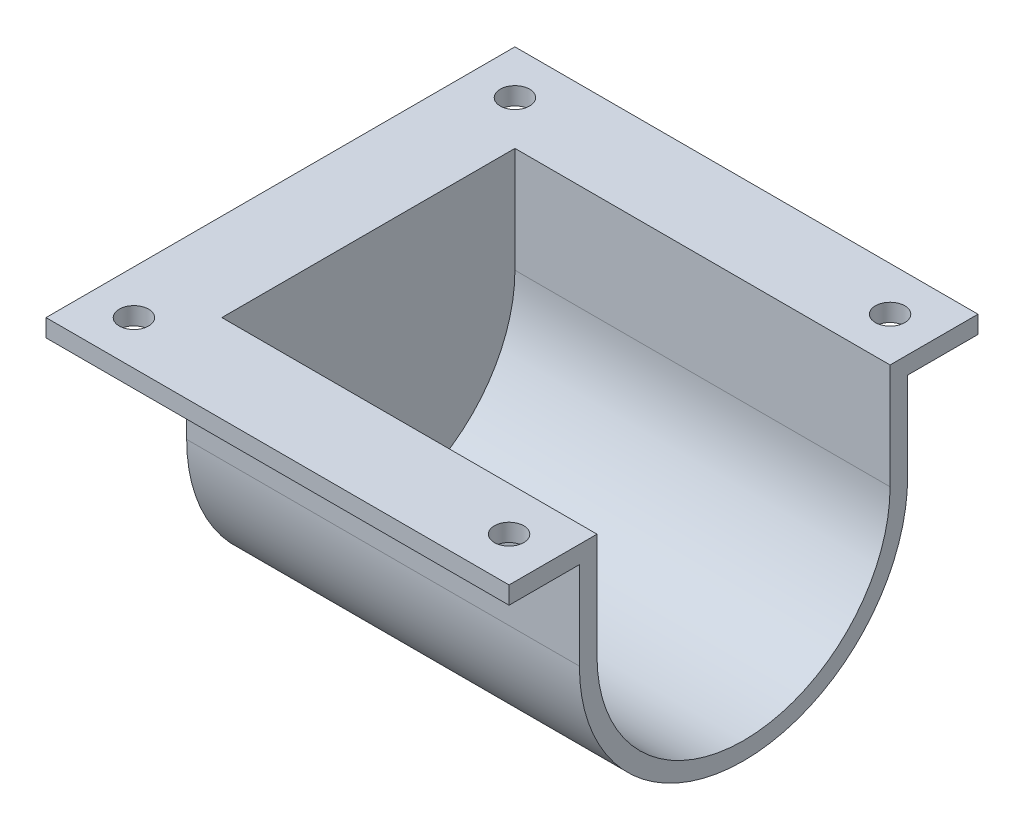
ISO-10303-21;
HEADER;
FILE_DESCRIPTION(('STEP AP214'),'2;1');
FILE_NAME('part.step','',(''),(''),'','','');
FILE_SCHEMA(('AUTOMOTIVE_DESIGN { 1 0 10303 214 1 1 1 1 }'));
ENDSEC;
DATA;
#1=APPLICATION_CONTEXT('core data for automotive mechanical design processes');
#2=APPLICATION_PROTOCOL_DEFINITION('international standard','automotive_design',2000,#1);
#3=PRODUCT_CONTEXT('',#1,'mechanical');
#4=PRODUCT('Part','Part','',(#3));
#5=PRODUCT_RELATED_PRODUCT_CATEGORY('part','',(#4));
#6=PRODUCT_DEFINITION_FORMATION('','',#4);
#7=PRODUCT_DEFINITION_CONTEXT('part definition',#1,'design');
#8=PRODUCT_DEFINITION('design','',#6,#7);
#9=PRODUCT_DEFINITION_SHAPE('','',#8);
#10=(LENGTH_UNIT() NAMED_UNIT(*) SI_UNIT(.MILLI.,.METRE.));
#11=(NAMED_UNIT(*) PLANE_ANGLE_UNIT() SI_UNIT($,.RADIAN.));
#12=(NAMED_UNIT(*) SI_UNIT($,.STERADIAN.) SOLID_ANGLE_UNIT());
#13=UNCERTAINTY_MEASURE_WITH_UNIT(LENGTH_MEASURE(1.E-05),#10,'distance_accuracy_value','');
#14=(GEOMETRIC_REPRESENTATION_CONTEXT(3) GLOBAL_UNCERTAINTY_ASSIGNED_CONTEXT((#13)) GLOBAL_UNIT_ASSIGNED_CONTEXT((#10,
#11,#12)) REPRESENTATION_CONTEXT('',''));
#15=CARTESIAN_POINT('',(0.,0.,0.));
#16=DIRECTION('',(0.,0.,1.));
#17=DIRECTION('',(1.,0.,0.));
#18=AXIS2_PLACEMENT_3D('',#15,#16,#17);
#19=CARTESIAN_POINT('',(-67.,0.,28.));
#20=DIRECTION('',(0.,0.,1.));
#21=DIRECTION('',(1.,0.,0.));
#22=AXIS2_PLACEMENT_3D('',#19,#20,#21);
#23=PLANE('',#22);
#24=DIRECTION('',(0.,-1.,0.));
#25=VECTOR('',#24,1.);
#26=CARTESIAN_POINT('',(0.,0.,28.));
#27=LINE('',#26,#25);
#28=CARTESIAN_POINT('',(0.,15.,28.));
#29=VERTEX_POINT('',#28);
#30=CARTESIAN_POINT('',(0.,0.,28.));
#31=VERTEX_POINT('',#30);
#32=EDGE_CURVE('E220',#29,#31,#27,.T.);
#33=ORIENTED_EDGE('',*,*,#32,.F.);
#34=DIRECTION('',(1.,0.,0.));
#35=VECTOR('',#34,1.);
#36=CARTESIAN_POINT('',(-67.,15.,28.));
#37=LINE('',#36,#35);
#38=CARTESIAN_POINT('',(-67.,15.,28.));
#39=VERTEX_POINT('',#38);
#40=EDGE_CURVE('E12',#39,#29,#37,.T.);
#41=ORIENTED_EDGE('',*,*,#40,.F.);
#42=DIRECTION('',(0.,-1.,0.));
#43=VECTOR('',#42,1.);
#44=CARTESIAN_POINT('',(-67.,0.,28.));
#45=LINE('',#44,#43);
#46=CARTESIAN_POINT('',(-67.,0.,28.));
#47=VERTEX_POINT('',#46);
#48=EDGE_CURVE('E225',#39,#47,#45,.T.);
#49=ORIENTED_EDGE('',*,*,#48,.T.);
#50=DIRECTION('',(1.,0.,0.));
#51=VECTOR('',#50,1.);
#52=CARTESIAN_POINT('',(-67.,0.,28.));
#53=LINE('',#52,#51);
#54=EDGE_CURVE('E54',#47,#31,#53,.T.);
#55=ORIENTED_EDGE('',*,*,#54,.T.);
#56=EDGE_LOOP('',(#33,#41,#49,#55));
#57=FACE_BOUND('',#56,.T.);
#58=ADVANCED_FACE('F55',(#57),#23,.T.);
#59=CARTESIAN_POINT('',(-67.,0.,-28.));
#60=DIRECTION('',(0.,0.,1.));
#61=DIRECTION('',(1.,0.,0.));
#62=AXIS2_PLACEMENT_3D('',#59,#60,#61);
#63=PLANE('',#62);
#64=DIRECTION('',(0.,-1.,0.));
#65=VECTOR('',#64,1.);
#66=CARTESIAN_POINT('',(0.,0.,-28.));
#67=LINE('',#66,#65);
#68=CARTESIAN_POINT('',(0.,15.,-28.));
#69=VERTEX_POINT('',#68);
#70=CARTESIAN_POINT('',(0.,0.,-28.));
#71=VERTEX_POINT('',#70);
#72=EDGE_CURVE('E227',#69,#71,#67,.T.);
#73=ORIENTED_EDGE('',*,*,#72,.T.);
#74=DIRECTION('',(1.,0.,0.));
#75=VECTOR('',#74,1.);
#76=CARTESIAN_POINT('',(-67.,0.,-28.));
#77=LINE('',#76,#75);
#78=CARTESIAN_POINT('',(-67.,0.,-28.));
#79=VERTEX_POINT('',#78);
#80=EDGE_CURVE('E237',#79,#71,#77,.T.);
#81=ORIENTED_EDGE('',*,*,#80,.F.);
#82=DIRECTION('',(0.,-1.,0.));
#83=VECTOR('',#82,1.);
#84=CARTESIAN_POINT('',(-67.,0.,-28.));
#85=LINE('',#84,#83);
#86=CARTESIAN_POINT('',(-67.,15.,-28.));
#87=VERTEX_POINT('',#86);
#88=EDGE_CURVE('E230',#87,#79,#85,.T.);
#89=ORIENTED_EDGE('',*,*,#88,.F.);
#90=DIRECTION('',(1.,0.,0.));
#91=VECTOR('',#90,1.);
#92=CARTESIAN_POINT('',(-67.,15.,-28.));
#93=LINE('',#92,#91);
#94=EDGE_CURVE('E58',#87,#69,#93,.T.);
#95=ORIENTED_EDGE('',*,*,#94,.T.);
#96=EDGE_LOOP('',(#73,#81,#89,#95));
#97=FACE_BOUND('',#96,.T.);
#98=ADVANCED_FACE('F254',(#97),#63,.F.);
#99=CARTESIAN_POINT('',(-67.,0.,0.));
#100=DIRECTION('',(1.,0.,0.));
#101=DIRECTION('',(0.,0.,-1.));
#102=AXIS2_PLACEMENT_3D('',#99,#100,#101);
#103=CYLINDRICAL_SURFACE('',#102,28.);
#104=CARTESIAN_POINT('',(0.,0.,0.));
#105=DIRECTION('',(1.,0.,0.));
#106=DIRECTION('',(0.,0.,-1.));
#107=AXIS2_PLACEMENT_3D('',#104,#105,#106);
#108=CIRCLE('',#107,28.);
#109=EDGE_CURVE('E232',#31,#71,#108,.T.);
#110=ORIENTED_EDGE('',*,*,#109,.F.);
#111=ORIENTED_EDGE('',*,*,#54,.F.);
#112=CARTESIAN_POINT('',(-67.,0.,0.));
#113=DIRECTION('',(1.,0.,0.));
#114=DIRECTION('',(0.,0.,-1.));
#115=AXIS2_PLACEMENT_3D('',#112,#113,#114);
#116=CIRCLE('',#115,28.);
#117=EDGE_CURVE('E228',#47,#79,#116,.T.);
#118=ORIENTED_EDGE('',*,*,#117,.T.);
#119=ORIENTED_EDGE('',*,*,#80,.T.);
#120=EDGE_LOOP('',(#110,#111,#118,#119));
#121=FACE_BOUND('',#120,.T.);
#122=ADVANCED_FACE('F241',(#121),#103,.T.);
#123=CARTESIAN_POINT('',(-67.,0.,0.));
#124=DIRECTION('',(1.,0.,0.));
#125=DIRECTION('',(0.,0.,-1.));
#126=AXIS2_PLACEMENT_3D('',#123,#124,#125);
#127=PLANE('',#126);
#128=ORIENTED_EDGE('',*,*,#48,.F.);
#129=DIRECTION('',(0.,0.,-1.));
#130=VECTOR('',#129,1.);
#131=CARTESIAN_POINT('',(-67.,15.,0.));
#132=LINE('',#131,#130);
#133=EDGE_CURVE('E233',#39,#87,#132,.T.);
#134=ORIENTED_EDGE('',*,*,#133,.T.);
#135=ORIENTED_EDGE('',*,*,#88,.T.);
#136=ORIENTED_EDGE('',*,*,#117,.F.);
#137=EDGE_LOOP('',(#128,#134,#135,#136));
#138=FACE_BOUND('',#137,.T.);
#139=ADVANCED_FACE('F255',(#138),#127,.F.);
#140=CARTESIAN_POINT('',(0.,0.,0.));
#141=DIRECTION('',(1.,0.,0.));
#142=DIRECTION('',(0.,0.,-1.));
#143=AXIS2_PLACEMENT_3D('',#140,#141,#142);
#144=PLANE('',#143);
#145=DIRECTION('',(0.,-1.,0.));
#146=VECTOR('',#145,1.);
#147=CARTESIAN_POINT('',(0.,0.,25.));
#148=LINE('',#147,#146);
#149=CARTESIAN_POINT('',(0.,18.,25.));
#150=VERTEX_POINT('',#149);
#151=CARTESIAN_POINT('',(0.,0.,25.));
#152=VERTEX_POINT('',#151);
#153=EDGE_CURVE('E187',#150,#152,#148,.T.);
#154=ORIENTED_EDGE('',*,*,#153,.F.);
#155=DIRECTION('',(0.,0.,1.));
#156=VECTOR('',#155,1.);
#157=CARTESIAN_POINT('',(0.,18.,0.));
#158=LINE('',#157,#156);
#159=CARTESIAN_POINT('',(0.,18.,40.));
#160=VERTEX_POINT('',#159);
#161=EDGE_CURVE('E167',#150,#160,#158,.T.);
#162=ORIENTED_EDGE('',*,*,#161,.T.);
#163=DIRECTION('',(0.,1.,0.));
#164=VECTOR('',#163,1.);
#165=CARTESIAN_POINT('',(0.,0.,40.));
#166=LINE('',#165,#164);
#167=CARTESIAN_POINT('',(0.,15.,40.));
#168=VERTEX_POINT('',#167);
#169=EDGE_CURVE('E209',#168,#160,#166,.T.);
#170=ORIENTED_EDGE('',*,*,#169,.F.);
#171=DIRECTION('',(0.,0.,-1.));
#172=VECTOR('',#171,1.);
#173=CARTESIAN_POINT('',(0.,15.,0.));
#174=LINE('',#173,#172);
#175=EDGE_CURVE('E196',#168,#29,#174,.T.);
#176=ORIENTED_EDGE('',*,*,#175,.T.);
#177=ORIENTED_EDGE('',*,*,#32,.T.);
#178=ORIENTED_EDGE('',*,*,#109,.T.);
#179=ORIENTED_EDGE('',*,*,#72,.F.);
#180=CARTESIAN_POINT('',(0.,15.,-40.));
#181=VERTEX_POINT('',#180);
#182=EDGE_CURVE('E211',#69,#181,#174,.T.);
#183=ORIENTED_EDGE('',*,*,#182,.T.);
#184=DIRECTION('',(0.,1.,0.));
#185=VECTOR('',#184,1.);
#186=CARTESIAN_POINT('',(0.,0.,-40.));
#187=LINE('',#186,#185);
#188=CARTESIAN_POINT('',(0.,18.,-40.));
#189=VERTEX_POINT('',#188);
#190=EDGE_CURVE('E171',#181,#189,#187,.T.);
#191=ORIENTED_EDGE('',*,*,#190,.T.);
#192=CARTESIAN_POINT('',(0.,18.,-25.));
#193=VERTEX_POINT('',#192);
#194=EDGE_CURVE('E207',#189,#193,#158,.T.);
#195=ORIENTED_EDGE('',*,*,#194,.T.);
#196=DIRECTION('',(0.,-1.,0.));
#197=VECTOR('',#196,1.);
#198=CARTESIAN_POINT('',(0.,0.,-25.));
#199=LINE('',#198,#197);
#200=CARTESIAN_POINT('',(0.,0.,-25.));
#201=VERTEX_POINT('',#200);
#202=EDGE_CURVE('E164',#193,#201,#199,.T.);
#203=ORIENTED_EDGE('',*,*,#202,.T.);
#204=CARTESIAN_POINT('',(0.,0.,0.));
#205=DIRECTION('',(1.,0.,0.));
#206=DIRECTION('',(0.,0.,-1.));
#207=AXIS2_PLACEMENT_3D('',#204,#205,#206);
#208=CIRCLE('',#207,25.);
#209=EDGE_CURVE('E189',#152,#201,#208,.T.);
#210=ORIENTED_EDGE('',*,*,#209,.F.);
#211=EDGE_LOOP('',(#154,#162,#170,#176,#177,#178,#179,#183,#191,#195,#203,#210));
#212=FACE_BOUND('',#211,.T.);
#213=ADVANCED_FACE('F243',(#212),#144,.T.);
#214=CARTESIAN_POINT('',(-79.,15.,0.));
#215=DIRECTION('',(0.,-1.,0.));
#216=DIRECTION('',(0.,0.,-1.));
#217=AXIS2_PLACEMENT_3D('',#214,#215,#216);
#218=PLANE('',#217);
#219=CARTESIAN_POINT('',(-71.5,15.,32.5));
#220=DIRECTION('',(0.,-1.,0.));
#221=DIRECTION('',(0.,0.,-1.));
#222=AXIS2_PLACEMENT_3D('',#219,#220,#221);
#223=CIRCLE('',#222,2.49999999999999);
#224=CARTESIAN_POINT('',(-71.5,15.,30.));
#225=VERTEX_POINT('',#224);
#226=EDGE_CURVE('E310',#225,#225,#223,.T.);
#227=ORIENTED_EDGE('',*,*,#226,.F.);
#228=EDGE_LOOP('',(#227));
#229=FACE_BOUND('',#228,.T.);
#230=CARTESIAN_POINT('',(-7.5,15.,32.5));
#231=DIRECTION('',(0.,-1.,0.));
#232=DIRECTION('',(0.,0.,-1.));
#233=AXIS2_PLACEMENT_3D('',#230,#231,#232);
#234=CIRCLE('',#233,2.49999999999999);
#235=CARTESIAN_POINT('',(-7.5,15.,30.));
#236=VERTEX_POINT('',#235);
#237=EDGE_CURVE('E311',#236,#236,#234,.T.);
#238=ORIENTED_EDGE('',*,*,#237,.F.);
#239=EDGE_LOOP('',(#238));
#240=FACE_BOUND('',#239,.T.);
#241=CARTESIAN_POINT('',(-71.5,15.,-32.5));
#242=DIRECTION('',(0.,-1.,0.));
#243=DIRECTION('',(0.,0.,-1.));
#244=AXIS2_PLACEMENT_3D('',#241,#242,#243);
#245=CIRCLE('',#244,2.49999999999999);
#246=CARTESIAN_POINT('',(-71.5,15.,-35.));
#247=VERTEX_POINT('',#246);
#248=EDGE_CURVE('E314',#247,#247,#245,.T.);
#249=ORIENTED_EDGE('',*,*,#248,.F.);
#250=EDGE_LOOP('',(#249));
#251=FACE_BOUND('',#250,.T.);
#252=CARTESIAN_POINT('',(-7.5,15.,-32.5));
#253=DIRECTION('',(0.,-1.,0.));
#254=DIRECTION('',(0.,0.,-1.));
#255=AXIS2_PLACEMENT_3D('',#252,#253,#254);
#256=CIRCLE('',#255,2.49999999999999);
#257=CARTESIAN_POINT('',(-7.5,15.,-35.));
#258=VERTEX_POINT('',#257);
#259=EDGE_CURVE('E177',#258,#258,#256,.T.);
#260=ORIENTED_EDGE('',*,*,#259,.F.);
#261=EDGE_LOOP('',(#260));
#262=FACE_BOUND('',#261,.T.);
#263=ORIENTED_EDGE('',*,*,#94,.F.);
#264=ORIENTED_EDGE('',*,*,#133,.F.);
#265=ORIENTED_EDGE('',*,*,#40,.T.);
#266=ORIENTED_EDGE('',*,*,#175,.F.);
#267=DIRECTION('',(1.,0.,0.));
#268=VECTOR('',#267,1.);
#269=CARTESIAN_POINT('',(-79.,15.,40.));
#270=LINE('',#269,#268);
#271=CARTESIAN_POINT('',(-79.,15.,40.));
#272=VERTEX_POINT('',#271);
#273=EDGE_CURVE('E218',#272,#168,#270,.T.);
#274=ORIENTED_EDGE('',*,*,#273,.F.);
#275=DIRECTION('',(0.,0.,-1.));
#276=VECTOR('',#275,1.);
#277=CARTESIAN_POINT('',(-79.,15.,0.));
#278=LINE('',#277,#276);
#279=CARTESIAN_POINT('',(-79.,15.,-40.));
#280=VERTEX_POINT('',#279);
#281=EDGE_CURVE('E204',#272,#280,#278,.T.);
#282=ORIENTED_EDGE('',*,*,#281,.T.);
#283=DIRECTION('',(1.,0.,0.));
#284=VECTOR('',#283,1.);
#285=CARTESIAN_POINT('',(-79.,15.,-40.));
#286=LINE('',#285,#284);
#287=EDGE_CURVE('E212',#280,#181,#286,.T.);
#288=ORIENTED_EDGE('',*,*,#287,.T.);
#289=ORIENTED_EDGE('',*,*,#182,.F.);
#290=EDGE_LOOP('',(#263,#264,#265,#266,#274,#282,#288,#289));
#291=FACE_BOUND('',#290,.T.);
#292=ADVANCED_FACE('F250',(#229,#240,#251,#262,#291),#218,.T.);
#293=CARTESIAN_POINT('',(-79.,0.,-40.));
#294=DIRECTION('',(0.,0.,-1.));
#295=DIRECTION('',(-1.,0.,0.));
#296=AXIS2_PLACEMENT_3D('',#293,#294,#295);
#297=PLANE('',#296);
#298=ORIENTED_EDGE('',*,*,#190,.F.);
#299=ORIENTED_EDGE('',*,*,#287,.F.);
#300=DIRECTION('',(0.,1.,0.));
#301=VECTOR('',#300,1.);
#302=CARTESIAN_POINT('',(-79.,0.,-40.));
#303=LINE('',#302,#301);
#304=CARTESIAN_POINT('',(-79.,18.,-40.));
#305=VERTEX_POINT('',#304);
#306=EDGE_CURVE('E195',#280,#305,#303,.T.);
#307=ORIENTED_EDGE('',*,*,#306,.T.);
#308=DIRECTION('',(1.,0.,0.));
#309=VECTOR('',#308,1.);
#310=CARTESIAN_POINT('',(-79.,18.,-40.));
#311=LINE('',#310,#309);
#312=EDGE_CURVE('E205',#305,#189,#311,.T.);
#313=ORIENTED_EDGE('',*,*,#312,.T.);
#314=EDGE_LOOP('',(#298,#299,#307,#313));
#315=FACE_BOUND('',#314,.T.);
#316=ADVANCED_FACE('F260',(#315),#297,.T.);
#317=CARTESIAN_POINT('',(-79.,0.,40.));
#318=DIRECTION('',(0.,0.,-1.));
#319=DIRECTION('',(0.,1.,0.));
#320=AXIS2_PLACEMENT_3D('',#317,#318,#319);
#321=PLANE('',#320);
#322=ORIENTED_EDGE('',*,*,#169,.T.);
#323=DIRECTION('',(1.,0.,0.));
#324=VECTOR('',#323,1.);
#325=CARTESIAN_POINT('',(-79.,18.,40.));
#326=LINE('',#325,#324);
#327=CARTESIAN_POINT('',(-79.,18.,40.));
#328=VERTEX_POINT('',#327);
#329=EDGE_CURVE('E223',#328,#160,#326,.T.);
#330=ORIENTED_EDGE('',*,*,#329,.F.);
#331=DIRECTION('',(0.,1.,0.));
#332=VECTOR('',#331,1.);
#333=CARTESIAN_POINT('',(-79.,0.,40.));
#334=LINE('',#333,#332);
#335=EDGE_CURVE('E197',#272,#328,#334,.T.);
#336=ORIENTED_EDGE('',*,*,#335,.F.);
#337=ORIENTED_EDGE('',*,*,#273,.T.);
#338=EDGE_LOOP('',(#322,#330,#336,#337));
#339=FACE_BOUND('',#338,.T.);
#340=ADVANCED_FACE('F270',(#339),#321,.F.);
#341=CARTESIAN_POINT('',(-79.,18.,0.));
#342=DIRECTION('',(0.,1.,0.));
#343=DIRECTION('',(0.,0.,1.));
#344=AXIS2_PLACEMENT_3D('',#341,#342,#343);
#345=PLANE('',#344);
#346=CARTESIAN_POINT('',(-71.5,18.,32.5));
#347=DIRECTION('',(0.,-1.,0.));
#348=DIRECTION('',(0.,0.,-1.));
#349=AXIS2_PLACEMENT_3D('',#346,#347,#348);
#350=CIRCLE('',#349,2.49999999999999);
#351=CARTESIAN_POINT('',(-71.5,18.,30.));
#352=VERTEX_POINT('',#351);
#353=EDGE_CURVE('E332',#352,#352,#350,.T.);
#354=ORIENTED_EDGE('',*,*,#353,.T.);
#355=EDGE_LOOP('',(#354));
#356=FACE_BOUND('',#355,.T.);
#357=CARTESIAN_POINT('',(-7.5,18.,32.5));
#358=DIRECTION('',(0.,-1.,0.));
#359=DIRECTION('',(0.,0.,-1.));
#360=AXIS2_PLACEMENT_3D('',#357,#358,#359);
#361=CIRCLE('',#360,2.49999999999999);
#362=CARTESIAN_POINT('',(-7.5,18.,30.));
#363=VERTEX_POINT('',#362);
#364=EDGE_CURVE('E328',#363,#363,#361,.T.);
#365=ORIENTED_EDGE('',*,*,#364,.T.);
#366=EDGE_LOOP('',(#365));
#367=FACE_BOUND('',#366,.T.);
#368=CARTESIAN_POINT('',(-71.5,18.,-32.5));
#369=DIRECTION('',(0.,-1.,0.));
#370=DIRECTION('',(0.,0.,-1.));
#371=AXIS2_PLACEMENT_3D('',#368,#369,#370);
#372=CIRCLE('',#371,2.49999999999999);
#373=CARTESIAN_POINT('',(-71.5,18.,-35.));
#374=VERTEX_POINT('',#373);
#375=EDGE_CURVE('E325',#374,#374,#372,.T.);
#376=ORIENTED_EDGE('',*,*,#375,.T.);
#377=EDGE_LOOP('',(#376));
#378=FACE_BOUND('',#377,.T.);
#379=CARTESIAN_POINT('',(-7.5,18.,-32.5));
#380=DIRECTION('',(0.,-1.,0.));
#381=DIRECTION('',(0.,0.,-1.));
#382=AXIS2_PLACEMENT_3D('',#379,#380,#381);
#383=CIRCLE('',#382,2.49999999999999);
#384=CARTESIAN_POINT('',(-7.5,18.,-35.));
#385=VERTEX_POINT('',#384);
#386=EDGE_CURVE('E316',#385,#385,#383,.T.);
#387=ORIENTED_EDGE('',*,*,#386,.T.);
#388=EDGE_LOOP('',(#387));
#389=FACE_BOUND('',#388,.T.);
#390=DIRECTION('',(1.,0.,0.));
#391=VECTOR('',#390,1.);
#392=CARTESIAN_POINT('',(-67.,18.,25.));
#393=LINE('',#392,#391);
#394=CARTESIAN_POINT('',(-64.,18.,25.));
#395=VERTEX_POINT('',#394);
#396=EDGE_CURVE('E163',#395,#150,#393,.T.);
#397=ORIENTED_EDGE('',*,*,#396,.F.);
#398=DIRECTION('',(0.,0.,-1.));
#399=VECTOR('',#398,1.);
#400=CARTESIAN_POINT('',(-64.,18.,0.));
#401=LINE('',#400,#399);
#402=CARTESIAN_POINT('',(-64.,18.,-25.));
#403=VERTEX_POINT('',#402);
#404=EDGE_CURVE('E148',#395,#403,#401,.T.);
#405=ORIENTED_EDGE('',*,*,#404,.T.);
#406=DIRECTION('',(1.,0.,0.));
#407=VECTOR('',#406,1.);
#408=CARTESIAN_POINT('',(-67.,18.,-25.));
#409=LINE('',#408,#407);
#410=EDGE_CURVE('E175',#403,#193,#409,.T.);
#411=ORIENTED_EDGE('',*,*,#410,.T.);
#412=ORIENTED_EDGE('',*,*,#194,.F.);
#413=ORIENTED_EDGE('',*,*,#312,.F.);
#414=DIRECTION('',(0.,0.,1.));
#415=VECTOR('',#414,1.);
#416=CARTESIAN_POINT('',(-79.,18.,0.));
#417=LINE('',#416,#415);
#418=EDGE_CURVE('E199',#305,#328,#417,.T.);
#419=ORIENTED_EDGE('',*,*,#418,.T.);
#420=ORIENTED_EDGE('',*,*,#329,.T.);
#421=ORIENTED_EDGE('',*,*,#161,.F.);
#422=EDGE_LOOP('',(#397,#405,#411,#412,#413,#419,#420,#421));
#423=FACE_BOUND('',#422,.T.);
#424=ADVANCED_FACE('F166',(#356,#367,#378,#389,#423),#345,.T.);
#425=CARTESIAN_POINT('',(-79.,0.,0.));
#426=DIRECTION('',(1.,0.,0.));
#427=DIRECTION('',(0.,0.,-1.));
#428=AXIS2_PLACEMENT_3D('',#425,#426,#427);
#429=PLANE('',#428);
#430=ORIENTED_EDGE('',*,*,#306,.F.);
#431=ORIENTED_EDGE('',*,*,#281,.F.);
#432=ORIENTED_EDGE('',*,*,#335,.T.);
#433=ORIENTED_EDGE('',*,*,#418,.F.);
#434=EDGE_LOOP('',(#430,#431,#432,#433));
#435=FACE_BOUND('',#434,.T.);
#436=ADVANCED_FACE('F272',(#435),#429,.F.);
#437=CARTESIAN_POINT('',(-67.,0.,25.));
#438=DIRECTION('',(0.,0.,1.));
#439=DIRECTION('',(1.,0.,0.));
#440=AXIS2_PLACEMENT_3D('',#437,#438,#439);
#441=PLANE('',#440);
#442=ORIENTED_EDGE('',*,*,#153,.T.);
#443=DIRECTION('',(1.,0.,0.));
#444=VECTOR('',#443,1.);
#445=CARTESIAN_POINT('',(-67.,0.,25.));
#446=LINE('',#445,#444);
#447=CARTESIAN_POINT('',(-64.,0.,25.));
#448=VERTEX_POINT('',#447);
#449=EDGE_CURVE('E158',#448,#152,#446,.T.);
#450=ORIENTED_EDGE('',*,*,#449,.F.);
#451=DIRECTION('',(0.,-1.,0.));
#452=VECTOR('',#451,1.);
#453=CARTESIAN_POINT('',(-64.,0.,25.));
#454=LINE('',#453,#452);
#455=EDGE_CURVE('E151',#395,#448,#454,.T.);
#456=ORIENTED_EDGE('',*,*,#455,.F.);
#457=ORIENTED_EDGE('',*,*,#396,.T.);
#458=EDGE_LOOP('',(#442,#450,#456,#457));
#459=FACE_BOUND('',#458,.T.);
#460=ADVANCED_FACE('F156',(#459),#441,.F.);
#461=CARTESIAN_POINT('',(-67.,0.,-25.));
#462=DIRECTION('',(0.,0.,1.));
#463=DIRECTION('',(1.,0.,0.));
#464=AXIS2_PLACEMENT_3D('',#461,#462,#463);
#465=PLANE('',#464);
#466=ORIENTED_EDGE('',*,*,#202,.F.);
#467=ORIENTED_EDGE('',*,*,#410,.F.);
#468=DIRECTION('',(0.,-1.,0.));
#469=VECTOR('',#468,1.);
#470=CARTESIAN_POINT('',(-64.,0.,-25.));
#471=LINE('',#470,#469);
#472=CARTESIAN_POINT('',(-64.,0.,-25.));
#473=VERTEX_POINT('',#472);
#474=EDGE_CURVE('E70',#403,#473,#471,.T.);
#475=ORIENTED_EDGE('',*,*,#474,.T.);
#476=DIRECTION('',(1.,0.,0.));
#477=VECTOR('',#476,1.);
#478=CARTESIAN_POINT('',(-67.,0.,-25.));
#479=LINE('',#478,#477);
#480=EDGE_CURVE('E176',#473,#201,#479,.T.);
#481=ORIENTED_EDGE('',*,*,#480,.T.);
#482=EDGE_LOOP('',(#466,#467,#475,#481));
#483=FACE_BOUND('',#482,.T.);
#484=ADVANCED_FACE('F265',(#483),#465,.T.);
#485=CARTESIAN_POINT('',(-67.,0.,0.));
#486=DIRECTION('',(1.,0.,0.));
#487=DIRECTION('',(0.,0.,-1.));
#488=AXIS2_PLACEMENT_3D('',#485,#486,#487);
#489=CYLINDRICAL_SURFACE('',#488,25.);
#490=ORIENTED_EDGE('',*,*,#209,.T.);
#491=ORIENTED_EDGE('',*,*,#480,.F.);
#492=CARTESIAN_POINT('',(-64.,0.,0.));
#493=DIRECTION('',(1.,0.,0.));
#494=DIRECTION('',(0.,0.,-1.));
#495=AXIS2_PLACEMENT_3D('',#492,#493,#494);
#496=CIRCLE('',#495,25.);
#497=EDGE_CURVE('E165',#448,#473,#496,.T.);
#498=ORIENTED_EDGE('',*,*,#497,.F.);
#499=ORIENTED_EDGE('',*,*,#449,.T.);
#500=EDGE_LOOP('',(#490,#491,#498,#499));
#501=FACE_BOUND('',#500,.T.);
#502=ADVANCED_FACE('F268',(#501),#489,.F.);
#503=CARTESIAN_POINT('',(-64.,0.,0.));
#504=DIRECTION('',(1.,0.,0.));
#505=DIRECTION('',(0.,0.,-1.));
#506=AXIS2_PLACEMENT_3D('',#503,#504,#505);
#507=PLANE('',#506);
#508=ORIENTED_EDGE('',*,*,#455,.T.);
#509=ORIENTED_EDGE('',*,*,#497,.T.);
#510=ORIENTED_EDGE('',*,*,#474,.F.);
#511=ORIENTED_EDGE('',*,*,#404,.F.);
#512=EDGE_LOOP('',(#508,#509,#510,#511));
#513=FACE_BOUND('',#512,.T.);
#514=ADVANCED_FACE('F154',(#513),#507,.T.);
#515=CARTESIAN_POINT('',(-7.5,0.,-32.5));
#516=DIRECTION('',(0.,-1.,0.));
#517=DIRECTION('',(0.,0.,-1.));
#518=AXIS2_PLACEMENT_3D('',#515,#516,#517);
#519=CYLINDRICAL_SURFACE('',#518,2.49999999999999);
#520=ORIENTED_EDGE('',*,*,#259,.T.);
#521=EDGE_LOOP('',(#520));
#522=FACE_BOUND('',#521,.T.);
#523=ORIENTED_EDGE('',*,*,#386,.F.);
#524=EDGE_LOOP('',(#523));
#525=FACE_BOUND('',#524,.T.);
#526=ADVANCED_FACE('F354',(#522,#525),#519,.F.);
#527=CARTESIAN_POINT('',(-71.5,0.,-32.5));
#528=DIRECTION('',(0.,-1.,0.));
#529=DIRECTION('',(0.,0.,-1.));
#530=AXIS2_PLACEMENT_3D('',#527,#528,#529);
#531=CYLINDRICAL_SURFACE('',#530,2.49999999999999);
#532=ORIENTED_EDGE('',*,*,#248,.T.);
#533=EDGE_LOOP('',(#532));
#534=FACE_BOUND('',#533,.T.);
#535=ORIENTED_EDGE('',*,*,#375,.F.);
#536=EDGE_LOOP('',(#535));
#537=FACE_BOUND('',#536,.T.);
#538=ADVANCED_FACE('F349',(#534,#537),#531,.F.);
#539=CARTESIAN_POINT('',(-7.5,0.,32.5));
#540=DIRECTION('',(0.,-1.,0.));
#541=DIRECTION('',(0.,0.,-1.));
#542=AXIS2_PLACEMENT_3D('',#539,#540,#541);
#543=CYLINDRICAL_SURFACE('',#542,2.49999999999999);
#544=ORIENTED_EDGE('',*,*,#237,.T.);
#545=EDGE_LOOP('',(#544));
#546=FACE_BOUND('',#545,.T.);
#547=ORIENTED_EDGE('',*,*,#364,.F.);
#548=EDGE_LOOP('',(#547));
#549=FACE_BOUND('',#548,.T.);
#550=ADVANCED_FACE('F338',(#546,#549),#543,.F.);
#551=CARTESIAN_POINT('',(-71.5,0.,32.5));
#552=DIRECTION('',(0.,-1.,0.));
#553=DIRECTION('',(0.,0.,-1.));
#554=AXIS2_PLACEMENT_3D('',#551,#552,#553);
#555=CYLINDRICAL_SURFACE('',#554,2.49999999999999);
#556=ORIENTED_EDGE('',*,*,#226,.T.);
#557=EDGE_LOOP('',(#556));
#558=FACE_BOUND('',#557,.T.);
#559=ORIENTED_EDGE('',*,*,#353,.F.);
#560=EDGE_LOOP('',(#559));
#561=FACE_BOUND('',#560,.T.);
#562=ADVANCED_FACE('F336',(#558,#561),#555,.F.);
#563=CLOSED_SHELL('',(#58,#98,#122,#139,#213,#292,#316,#340,#424,#436,#460,#484,#502,#514,#526,
#538,#550,#562));
#564=MANIFOLD_SOLID_BREP('B2',#563);
#565=ADVANCED_BREP_SHAPE_REPRESENTATION('',(#18,#564),#14);
#566=SHAPE_DEFINITION_REPRESENTATION(#9,#565);
ENDSEC;
END-ISO-10303-21;
